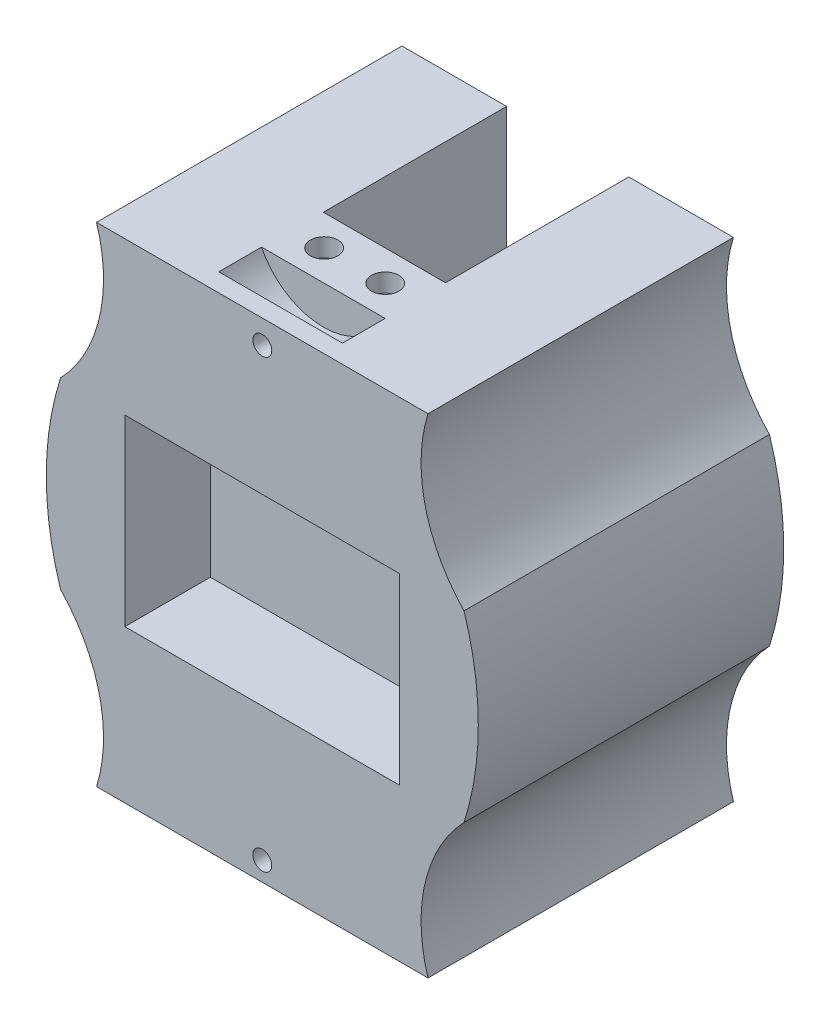
ISO-10303-21;
HEADER;
FILE_DESCRIPTION(('STEP AP214'),'2;1');
FILE_NAME('part.step','',(''),(''),'','','');
FILE_SCHEMA(('AUTOMOTIVE_DESIGN { 1 0 10303 214 1 1 1 1 }'));
ENDSEC;
DATA;
#1=APPLICATION_CONTEXT('core data for automotive mechanical design processes');
#2=APPLICATION_PROTOCOL_DEFINITION('international standard','automotive_design',2000,#1);
#3=PRODUCT_CONTEXT('',#1,'mechanical');
#4=PRODUCT('Part','Part','',(#3));
#5=PRODUCT_RELATED_PRODUCT_CATEGORY('part','',(#4));
#6=PRODUCT_DEFINITION_FORMATION('','',#4);
#7=PRODUCT_DEFINITION_CONTEXT('part definition',#1,'design');
#8=PRODUCT_DEFINITION('design','',#6,#7);
#9=PRODUCT_DEFINITION_SHAPE('','',#8);
#10=(LENGTH_UNIT() NAMED_UNIT(*) SI_UNIT(.MILLI.,.METRE.));
#11=(NAMED_UNIT(*) PLANE_ANGLE_UNIT() SI_UNIT($,.RADIAN.));
#12=(NAMED_UNIT(*) SI_UNIT($,.STERADIAN.) SOLID_ANGLE_UNIT());
#13=UNCERTAINTY_MEASURE_WITH_UNIT(LENGTH_MEASURE(1.E-05),#10,'distance_accuracy_value','');
#14=(GEOMETRIC_REPRESENTATION_CONTEXT(3) GLOBAL_UNCERTAINTY_ASSIGNED_CONTEXT((#13)) GLOBAL_UNIT_ASSIGNED_CONTEXT((#10,
#11,#12)) REPRESENTATION_CONTEXT('',''));
#15=CARTESIAN_POINT('',(0.,0.,0.));
#16=DIRECTION('',(0.,0.,1.));
#17=DIRECTION('',(1.,0.,0.));
#18=AXIS2_PLACEMENT_3D('',#15,#16,#17);
#19=CARTESIAN_POINT('',(0.,-40.,30.));
#20=DIRECTION('',(0.,1.,0.));
#21=DIRECTION('',(0.,0.,1.));
#22=AXIS2_PLACEMENT_3D('',#19,#20,#21);
#23=PLANE('',#22);
#24=CARTESIAN_POINT('',(5.12499999999996,-40.,15.));
#25=DIRECTION('',(0.,-1.,0.));
#26=DIRECTION('',(0.,0.,-1.));
#27=AXIS2_PLACEMENT_3D('',#24,#25,#26);
#28=CIRCLE('',#27,2.25);
#29=CARTESIAN_POINT('',(5.12499999999996,-40.,12.75));
#30=VERTEX_POINT('',#29);
#31=EDGE_CURVE('E452',#30,#30,#28,.T.);
#32=ORIENTED_EDGE('',*,*,#31,.F.);
#33=EDGE_LOOP('',(#32));
#34=FACE_BOUND('',#33,.T.);
#35=CARTESIAN_POINT('',(-4.87500000000004,-40.,15.));
#36=DIRECTION('',(0.,-1.,0.));
#37=DIRECTION('',(0.,0.,-1.));
#38=AXIS2_PLACEMENT_3D('',#35,#36,#37);
#39=CIRCLE('',#38,2.25);
#40=CARTESIAN_POINT('',(-4.87500000000004,-40.,12.75));
#41=VERTEX_POINT('',#40);
#42=EDGE_CURVE('E447',#41,#41,#39,.T.);
#43=ORIENTED_EDGE('',*,*,#42,.F.);
#44=EDGE_LOOP('',(#43));
#45=FACE_BOUND('',#44,.T.);
#46=DIRECTION('',(1.,0.,0.));
#47=VECTOR('',#46,1.);
#48=CARTESIAN_POINT('',(-10.1193783877815,-40.,27.));
#49=LINE('',#48,#47);
#50=CARTESIAN_POINT('',(-10.1193783877815,-40.,27.));
#51=VERTEX_POINT('',#50);
#52=CARTESIAN_POINT('',(10.1193783877815,-40.,27.));
#53=VERTEX_POINT('',#52);
#54=EDGE_CURVE('E557',#51,#53,#49,.T.);
#55=ORIENTED_EDGE('',*,*,#54,.T.);
#56=DIRECTION('',(0.,0.,1.));
#57=VECTOR('',#56,1.);
#58=CARTESIAN_POINT('',(10.1193783877815,-40.,20.));
#59=LINE('',#58,#57);
#60=CARTESIAN_POINT('',(10.1193783877815,-40.,20.));
#61=VERTEX_POINT('',#60);
#62=EDGE_CURVE('E620',#61,#53,#59,.T.);
#63=ORIENTED_EDGE('',*,*,#62,.F.);
#64=DIRECTION('',(1.,0.,0.));
#65=VECTOR('',#64,1.);
#66=CARTESIAN_POINT('',(0.,-40.,20.));
#67=LINE('',#66,#65);
#68=CARTESIAN_POINT('',(-10.1193783877815,-40.,20.));
#69=VERTEX_POINT('',#68);
#70=EDGE_CURVE('E616',#69,#61,#67,.T.);
#71=ORIENTED_EDGE('',*,*,#70,.F.);
#72=DIRECTION('',(0.,0.,1.));
#73=VECTOR('',#72,1.);
#74=CARTESIAN_POINT('',(-10.1193783877815,-40.,20.));
#75=LINE('',#74,#73);
#76=EDGE_CURVE('E619',#69,#51,#75,.T.);
#77=ORIENTED_EDGE('',*,*,#76,.T.);
#78=EDGE_LOOP('',(#55,#63,#71,#77));
#79=FACE_BOUND('',#78,.T.);
#80=DIRECTION('',(0.,0.,-1.));
#81=VECTOR('',#80,1.);
#82=CARTESIAN_POINT('',(9.99999999999994,-40.,10.));
#83=LINE('',#82,#81);
#84=CARTESIAN_POINT('',(9.99999999999994,-40.,10.));
#85=VERTEX_POINT('',#84);
#86=CARTESIAN_POINT('',(9.99999999999994,-40.,-20.));
#87=VERTEX_POINT('',#86);
#88=EDGE_CURVE('E472',#85,#87,#83,.T.);
#89=ORIENTED_EDGE('',*,*,#88,.T.);
#90=DIRECTION('',(-1.,0.,0.));
#91=VECTOR('',#90,1.);
#92=CARTESIAN_POINT('',(27.1336624385242,-40.,-20.));
#93=LINE('',#92,#91);
#94=CARTESIAN_POINT('',(27.1336624385242,-40.,-20.));
#95=VERTEX_POINT('',#94);
#96=EDGE_CURVE('E526',#95,#87,#93,.T.);
#97=ORIENTED_EDGE('',*,*,#96,.F.);
#98=DIRECTION('',(0.,0.,1.));
#99=VECTOR('',#98,1.);
#100=CARTESIAN_POINT('',(27.1336624385242,-40.,14.));
#101=LINE('',#100,#99);
#102=CARTESIAN_POINT('',(27.1336624385242,-40.,30.));
#103=VERTEX_POINT('',#102);
#104=EDGE_CURVE('E570',#95,#103,#101,.T.);
#105=ORIENTED_EDGE('',*,*,#104,.T.);
#106=DIRECTION('',(1.,0.,0.));
#107=VECTOR('',#106,1.);
#108=CARTESIAN_POINT('',(0.,-40.,30.));
#109=LINE('',#108,#107);
#110=CARTESIAN_POINT('',(-27.1336624385243,-40.,30.));
#111=VERTEX_POINT('',#110);
#112=EDGE_CURVE('E638',#111,#103,#109,.T.);
#113=ORIENTED_EDGE('',*,*,#112,.F.);
#114=DIRECTION('',(0.,0.,1.));
#115=VECTOR('',#114,1.);
#116=CARTESIAN_POINT('',(-27.1336624385243,-40.,14.));
#117=LINE('',#116,#115);
#118=CARTESIAN_POINT('',(-27.1336624385243,-40.,-20.));
#119=VERTEX_POINT('',#118);
#120=EDGE_CURVE('E580',#119,#111,#117,.T.);
#121=ORIENTED_EDGE('',*,*,#120,.F.);
#122=CARTESIAN_POINT('',(-10.,-40.,-20.));
#123=VERTEX_POINT('',#122);
#124=EDGE_CURVE('E525',#123,#119,#93,.T.);
#125=ORIENTED_EDGE('',*,*,#124,.F.);
#126=DIRECTION('',(0.,0.,-1.));
#127=VECTOR('',#126,1.);
#128=CARTESIAN_POINT('',(-10.,-40.,10.));
#129=LINE('',#128,#127);
#130=CARTESIAN_POINT('',(-10.,-40.,10.));
#131=VERTEX_POINT('',#130);
#132=EDGE_CURVE('E265',#131,#123,#129,.T.);
#133=ORIENTED_EDGE('',*,*,#132,.F.);
#134=DIRECTION('',(-1.,0.,0.));
#135=VECTOR('',#134,1.);
#136=CARTESIAN_POINT('',(0.,-40.,10.));
#137=LINE('',#136,#135);
#138=EDGE_CURVE('E463',#85,#131,#137,.T.);
#139=ORIENTED_EDGE('',*,*,#138,.F.);
#140=EDGE_LOOP('',(#89,#97,#105,#113,#121,#125,#133,#139));
#141=FACE_BOUND('',#140,.T.);
#142=ADVANCED_FACE('F250',(#34,#45,#79,#141),#23,.F.);
#143=CARTESIAN_POINT('',(51.2596627791283,32.4928057587116,-20.));
#144=DIRECTION('',(0.,0.,-1.));
#145=DIRECTION('',(-1.,0.,0.));
#146=AXIS2_PLACEMENT_3D('',#143,#144,#145);
#147=PLANE('',#146);
#148=CARTESIAN_POINT('',(28.2211690363349,-3.29857819905195,-20.));
#149=DIRECTION('',(0.,0.,-1.));
#150=DIRECTION('',(-1.,0.,0.));
#151=AXIS2_PLACEMENT_3D('',#148,#149,#150);
#152=CIRCLE('',#151,2.);
#153=CARTESIAN_POINT('',(26.2211690363349,-3.29857819905195,-20.));
#154=VERTEX_POINT('',#153);
#155=EDGE_CURVE('E441',#154,#154,#152,.T.);
#156=ORIENTED_EDGE('',*,*,#155,.F.);
#157=EDGE_LOOP('',(#156));
#158=FACE_BOUND('',#157,.T.);
#159=CARTESIAN_POINT('',(28.2211690363349,10.0179041600844,-20.));
#160=DIRECTION('',(0.,0.,-1.));
#161=DIRECTION('',(-1.,0.,0.));
#162=AXIS2_PLACEMENT_3D('',#159,#160,#161);
#163=CIRCLE('',#162,2.);
#164=CARTESIAN_POINT('',(26.2211690363349,10.0179041600844,-20.));
#165=VERTEX_POINT('',#164);
#166=EDGE_CURVE('E438',#165,#165,#163,.T.);
#167=ORIENTED_EDGE('',*,*,#166,.F.);
#168=EDGE_LOOP('',(#167));
#169=FACE_BOUND('',#168,.T.);
#170=ORIENTED_EDGE('',*,*,#96,.T.);
#171=DIRECTION('',(0.,1.,0.));
#172=VECTOR('',#171,1.);
#173=CARTESIAN_POINT('',(9.99999999999999,0.,-20.));
#174=LINE('',#173,#172);
#175=CARTESIAN_POINT('',(9.99999999999998,-13.5,-20.));
#176=VERTEX_POINT('',#175);
#177=EDGE_CURVE('E451',#87,#176,#174,.T.);
#178=ORIENTED_EDGE('',*,*,#177,.T.);
#179=DIRECTION('',(-1.,0.,0.));
#180=VECTOR('',#179,1.);
#181=CARTESIAN_POINT('',(0.,-13.5,-20.));
#182=LINE('',#181,#180);
#183=CARTESIAN_POINT('',(-10.,-13.5,-20.));
#184=VERTEX_POINT('',#183);
#185=EDGE_CURVE('E464',#176,#184,#182,.T.);
#186=ORIENTED_EDGE('',*,*,#185,.T.);
#187=DIRECTION('',(0.,1.,0.));
#188=VECTOR('',#187,1.);
#189=CARTESIAN_POINT('',(-10.,0.,-20.));
#190=LINE('',#189,#188);
#191=EDGE_CURVE('E475',#123,#184,#190,.T.);
#192=ORIENTED_EDGE('',*,*,#191,.F.);
#193=ORIENTED_EDGE('',*,*,#124,.T.);
#194=CARTESIAN_POINT('',(-51.2596627791282,-32.4928057587116,-20.));
#195=DIRECTION('',(0.,0.,1.));
#196=DIRECTION('',(-1.,0.,0.));
#197=AXIS2_PLACEMENT_3D('',#194,#195,#196);
#198=CIRCLE('',#197,25.2670112560084);
#199=CARTESIAN_POINT('',(-33.027175167745,-15.,-20.));
#200=VERTEX_POINT('',#199);
#201=EDGE_CURVE('E529',#119,#200,#198,.T.);
#202=ORIENTED_EDGE('',*,*,#201,.T.);
#203=CARTESIAN_POINT('',(14.0025176860576,0.,-20.));
#204=DIRECTION('',(0.,0.,-1.));
#205=DIRECTION('',(1.,0.,0.));
#206=AXIS2_PLACEMENT_3D('',#203,#204,#205);
#207=CIRCLE('',#206,49.3638735303766);
#208=CARTESIAN_POINT('',(-33.027175167745,15.,-20.));
#209=VERTEX_POINT('',#208);
#210=EDGE_CURVE('E532',#200,#209,#207,.T.);
#211=ORIENTED_EDGE('',*,*,#210,.T.);
#212=CARTESIAN_POINT('',(-51.259662779128,32.4928057587116,-20.));
#213=DIRECTION('',(0.,0.,1.));
#214=DIRECTION('',(-1.,0.,0.));
#215=AXIS2_PLACEMENT_3D('',#212,#213,#214);
#216=CIRCLE('',#215,25.2670112560083);
#217=CARTESIAN_POINT('',(-27.1336624385242,40.,-20.));
#218=VERTEX_POINT('',#217);
#219=EDGE_CURVE('E535',#209,#218,#216,.T.);
#220=ORIENTED_EDGE('',*,*,#219,.T.);
#221=DIRECTION('',(1.,0.,0.));
#222=VECTOR('',#221,1.);
#223=CARTESIAN_POINT('',(27.1336624385243,40.,-20.));
#224=LINE('',#223,#222);
#225=CARTESIAN_POINT('',(-10.,40.,-20.));
#226=VERTEX_POINT('',#225);
#227=EDGE_CURVE('E539',#218,#226,#224,.T.);
#228=ORIENTED_EDGE('',*,*,#227,.T.);
#229=DIRECTION('',(0.,1.,0.));
#230=VECTOR('',#229,1.);
#231=CARTESIAN_POINT('',(-10.,32.4928057587116,-20.));
#232=LINE('',#231,#230);
#233=CARTESIAN_POINT('',(-10.,13.5,-20.));
#234=VERTEX_POINT('',#233);
#235=EDGE_CURVE('E258',#234,#226,#232,.T.);
#236=ORIENTED_EDGE('',*,*,#235,.F.);
#237=DIRECTION('',(1.,0.,0.));
#238=VECTOR('',#237,1.);
#239=CARTESIAN_POINT('',(51.2596627791283,13.5,-20.));
#240=LINE('',#239,#238);
#241=CARTESIAN_POINT('',(9.99999999999999,13.5,-20.));
#242=VERTEX_POINT('',#241);
#243=EDGE_CURVE('E641',#234,#242,#240,.T.);
#244=ORIENTED_EDGE('',*,*,#243,.T.);
#245=DIRECTION('',(0.,-1.,0.));
#246=VECTOR('',#245,1.);
#247=CARTESIAN_POINT('',(9.99999999999999,32.4928057587116,-20.));
#248=LINE('',#247,#246);
#249=CARTESIAN_POINT('',(10.,40.,-20.));
#250=VERTEX_POINT('',#249);
#251=EDGE_CURVE('E12',#250,#242,#248,.T.);
#252=ORIENTED_EDGE('',*,*,#251,.F.);
#253=CARTESIAN_POINT('',(27.1336624385243,40.,-20.));
#254=VERTEX_POINT('',#253);
#255=EDGE_CURVE('E538',#250,#254,#224,.T.);
#256=ORIENTED_EDGE('',*,*,#255,.T.);
#257=CARTESIAN_POINT('',(51.2596627791283,32.4928057587116,-20.));
#258=DIRECTION('',(0.,0.,1.));
#259=DIRECTION('',(-1.,0.,0.));
#260=AXIS2_PLACEMENT_3D('',#257,#258,#259);
#261=CIRCLE('',#260,25.2670112560085);
#262=CARTESIAN_POINT('',(33.027175167745,15.,-20.));
#263=VERTEX_POINT('',#262);
#264=EDGE_CURVE('E514',#254,#263,#261,.T.);
#265=ORIENTED_EDGE('',*,*,#264,.T.);
#266=CARTESIAN_POINT('',(-14.0025176860581,0.,-20.));
#267=DIRECTION('',(0.,0.,-1.));
#268=DIRECTION('',(1.,0.,0.));
#269=AXIS2_PLACEMENT_3D('',#266,#267,#268);
#270=CIRCLE('',#269,49.363873530377);
#271=CARTESIAN_POINT('',(33.027175167745,-15.,-20.));
#272=VERTEX_POINT('',#271);
#273=EDGE_CURVE('E519',#263,#272,#270,.T.);
#274=ORIENTED_EDGE('',*,*,#273,.T.);
#275=CARTESIAN_POINT('',(51.2596627791291,-32.4928057587118,-20.));
#276=DIRECTION('',(0.,0.,1.));
#277=DIRECTION('',(-1.,0.,0.));
#278=AXIS2_PLACEMENT_3D('',#275,#276,#277);
#279=CIRCLE('',#278,25.2670112560092);
#280=EDGE_CURVE('E522',#272,#95,#279,.T.);
#281=ORIENTED_EDGE('',*,*,#280,.T.);
#282=EDGE_LOOP('',(#170,#178,#186,#192,#193,#202,#211,#220,#228,#236,#244,#252,#256,#265,#274,#281));
#283=FACE_BOUND('',#282,.T.);
#284=ADVANCED_FACE('F655',(#158,#169,#283),#147,.T.);
#285=CARTESIAN_POINT('',(0.,40.,30.));
#286=DIRECTION('',(0.,1.,0.));
#287=DIRECTION('',(0.,0.,1.));
#288=AXIS2_PLACEMENT_3D('',#285,#286,#287);
#289=PLANE('',#288);
#290=CARTESIAN_POINT('',(5.125,40.,15.));
#291=DIRECTION('',(0.,1.,0.));
#292=DIRECTION('',(0.,0.,1.));
#293=AXIS2_PLACEMENT_3D('',#290,#291,#292);
#294=CIRCLE('',#293,2.25);
#295=CARTESIAN_POINT('',(5.125,40.,17.25));
#296=VERTEX_POINT('',#295);
#297=EDGE_CURVE('E482',#296,#296,#294,.T.);
#298=ORIENTED_EDGE('',*,*,#297,.F.);
#299=EDGE_LOOP('',(#298));
#300=FACE_BOUND('',#299,.T.);
#301=CARTESIAN_POINT('',(-4.875,40.,15.));
#302=DIRECTION('',(0.,1.,0.));
#303=DIRECTION('',(0.,0.,1.));
#304=AXIS2_PLACEMENT_3D('',#301,#302,#303);
#305=CIRCLE('',#304,2.25);
#306=CARTESIAN_POINT('',(-4.875,40.,17.25));
#307=VERTEX_POINT('',#306);
#308=EDGE_CURVE('E491',#307,#307,#305,.T.);
#309=ORIENTED_EDGE('',*,*,#308,.F.);
#310=EDGE_LOOP('',(#309));
#311=FACE_BOUND('',#310,.T.);
#312=DIRECTION('',(0.,0.,-1.));
#313=VECTOR('',#312,1.);
#314=CARTESIAN_POINT('',(9.99999999999999,40.,-50.));
#315=LINE('',#314,#313);
#316=CARTESIAN_POINT('',(10.,40.,10.));
#317=VERTEX_POINT('',#316);
#318=EDGE_CURVE('E497',#317,#250,#315,.T.);
#319=ORIENTED_EDGE('',*,*,#318,.F.);
#320=DIRECTION('',(1.,0.,0.));
#321=VECTOR('',#320,1.);
#322=CARTESIAN_POINT('',(-10.,40.,10.));
#323=LINE('',#322,#321);
#324=CARTESIAN_POINT('',(-10.,40.,10.));
#325=VERTEX_POINT('',#324);
#326=EDGE_CURVE('E502',#325,#317,#323,.T.);
#327=ORIENTED_EDGE('',*,*,#326,.F.);
#328=DIRECTION('',(0.,0.,1.));
#329=VECTOR('',#328,1.);
#330=CARTESIAN_POINT('',(-10.,40.,-50.));
#331=LINE('',#330,#329);
#332=EDGE_CURVE('E508',#226,#325,#331,.T.);
#333=ORIENTED_EDGE('',*,*,#332,.F.);
#334=ORIENTED_EDGE('',*,*,#227,.F.);
#335=DIRECTION('',(0.,0.,1.));
#336=VECTOR('',#335,1.);
#337=CARTESIAN_POINT('',(-27.1336624385242,40.,14.));
#338=LINE('',#337,#336);
#339=CARTESIAN_POINT('',(-27.1336624385242,40.,30.));
#340=VERTEX_POINT('',#339);
#341=EDGE_CURVE('E583',#218,#340,#338,.T.);
#342=ORIENTED_EDGE('',*,*,#341,.T.);
#343=DIRECTION('',(1.,0.,0.));
#344=VECTOR('',#343,1.);
#345=CARTESIAN_POINT('',(0.,40.,30.));
#346=LINE('',#345,#344);
#347=CARTESIAN_POINT('',(27.1336624385243,40.,30.));
#348=VERTEX_POINT('',#347);
#349=EDGE_CURVE('E634',#340,#348,#346,.T.);
#350=ORIENTED_EDGE('',*,*,#349,.T.);
#351=DIRECTION('',(0.,0.,1.));
#352=VECTOR('',#351,1.);
#353=CARTESIAN_POINT('',(27.1336624385243,40.,14.));
#354=LINE('',#353,#352);
#355=EDGE_CURVE('E595',#254,#348,#354,.T.);
#356=ORIENTED_EDGE('',*,*,#355,.F.);
#357=ORIENTED_EDGE('',*,*,#255,.F.);
#358=EDGE_LOOP('',(#319,#327,#333,#334,#342,#350,#356,#357));
#359=FACE_BOUND('',#358,.T.);
#360=DIRECTION('',(-1.,0.,0.));
#361=VECTOR('',#360,1.);
#362=CARTESIAN_POINT('',(-10.1193783877815,40.,27.));
#363=LINE('',#362,#361);
#364=CARTESIAN_POINT('',(10.1193783877815,40.,27.));
#365=VERTEX_POINT('',#364);
#366=CARTESIAN_POINT('',(-10.1193783877815,40.,27.));
#367=VERTEX_POINT('',#366);
#368=EDGE_CURVE('E562',#365,#367,#363,.T.);
#369=ORIENTED_EDGE('',*,*,#368,.T.);
#370=DIRECTION('',(0.,0.,1.));
#371=VECTOR('',#370,1.);
#372=CARTESIAN_POINT('',(-10.1193783877815,40.,20.));
#373=LINE('',#372,#371);
#374=CARTESIAN_POINT('',(-10.1193783877815,40.,20.));
#375=VERTEX_POINT('',#374);
#376=EDGE_CURVE('E630',#375,#367,#373,.T.);
#377=ORIENTED_EDGE('',*,*,#376,.F.);
#378=DIRECTION('',(-1.,0.,0.));
#379=VECTOR('',#378,1.);
#380=CARTESIAN_POINT('',(0.,40.,20.));
#381=LINE('',#380,#379);
#382=CARTESIAN_POINT('',(10.1193783877815,40.,20.));
#383=VERTEX_POINT('',#382);
#384=EDGE_CURVE('E623',#383,#375,#381,.T.);
#385=ORIENTED_EDGE('',*,*,#384,.F.);
#386=DIRECTION('',(0.,0.,1.));
#387=VECTOR('',#386,1.);
#388=CARTESIAN_POINT('',(10.1193783877815,40.,20.));
#389=LINE('',#388,#387);
#390=EDGE_CURVE('E631',#383,#365,#389,.T.);
#391=ORIENTED_EDGE('',*,*,#390,.T.);
#392=EDGE_LOOP('',(#369,#377,#385,#391));
#393=FACE_BOUND('',#392,.T.);
#394=ADVANCED_FACE('F252',(#300,#311,#359,#393),#289,.T.);
#395=CARTESIAN_POINT('',(0.,44.9918574381775,20.));
#396=DIRECTION('',(0.,0.,1.));
#397=DIRECTION('',(1.,0.,0.));
#398=AXIS2_PLACEMENT_3D('',#395,#396,#397);
#399=CYLINDRICAL_SURFACE('',#398,11.283636809034);
#400=CARTESIAN_POINT('',(0.,44.9918574381775,27.));
#401=DIRECTION('',(0.,0.,1.));
#402=DIRECTION('',(1.,0.,0.));
#403=AXIS2_PLACEMENT_3D('',#400,#401,#402);
#404=CIRCLE('',#403,11.283636809034);
#405=EDGE_CURVE('E560',#367,#365,#404,.T.);
#406=ORIENTED_EDGE('',*,*,#405,.T.);
#407=ORIENTED_EDGE('',*,*,#390,.F.);
#408=CARTESIAN_POINT('',(0.,44.9918574381775,20.));
#409=DIRECTION('',(0.,0.,1.));
#410=DIRECTION('',(1.,0.,0.));
#411=AXIS2_PLACEMENT_3D('',#408,#409,#410);
#412=CIRCLE('',#411,11.283636809034);
#413=EDGE_CURVE('E627',#375,#383,#412,.T.);
#414=ORIENTED_EDGE('',*,*,#413,.F.);
#415=ORIENTED_EDGE('',*,*,#376,.T.);
#416=EDGE_LOOP('',(#406,#407,#414,#415));
#417=FACE_BOUND('',#416,.T.);
#418=ADVANCED_FACE('F707',(#417),#399,.F.);
#419=CARTESIAN_POINT('',(0.,0.,30.));
#420=DIRECTION('',(0.,0.,1.));
#421=DIRECTION('',(1.,0.,0.));
#422=AXIS2_PLACEMENT_3D('',#419,#420,#421);
#423=PLANE('',#422);
#424=CARTESIAN_POINT('',(0.,36.1458896854283,30.));
#425=DIRECTION('',(0.,0.,1.));
#426=DIRECTION('',(1.,0.,0.));
#427=AXIS2_PLACEMENT_3D('',#424,#425,#426);
#428=CIRCLE('',#427,1.55);
#429=CARTESIAN_POINT('',(1.55,36.1458896854283,30.));
#430=VERTEX_POINT('',#429);
#431=EDGE_CURVE('E545',#430,#430,#428,.T.);
#432=ORIENTED_EDGE('',*,*,#431,.F.);
#433=EDGE_LOOP('',(#432));
#434=FACE_BOUND('',#433,.T.);
#435=CARTESIAN_POINT('',(0.,-36.8541103145717,30.));
#436=DIRECTION('',(0.,0.,-1.));
#437=DIRECTION('',(-1.,0.,0.));
#438=AXIS2_PLACEMENT_3D('',#435,#436,#437);
#439=CIRCLE('',#438,1.55);
#440=CARTESIAN_POINT('',(-1.55000000000001,-36.8541103145717,30.));
#441=VERTEX_POINT('',#440);
#442=EDGE_CURVE('E549',#441,#441,#439,.T.);
#443=ORIENTED_EDGE('',*,*,#442,.T.);
#444=EDGE_LOOP('',(#443));
#445=FACE_BOUND('',#444,.T.);
#446=CARTESIAN_POINT('',(-51.2596627791281,-32.4928057587115,30.));
#447=DIRECTION('',(0.,0.,1.));
#448=DIRECTION('',(1.,0.,0.));
#449=AXIS2_PLACEMENT_3D('',#446,#447,#448);
#450=CIRCLE('',#449,25.2670112560083);
#451=CARTESIAN_POINT('',(-33.027175167745,-15.,30.));
#452=VERTEX_POINT('',#451);
#453=EDGE_CURVE('E573',#111,#452,#450,.T.);
#454=ORIENTED_EDGE('',*,*,#453,.F.);
#455=ORIENTED_EDGE('',*,*,#112,.T.);
#456=CARTESIAN_POINT('',(51.259662779128,-32.4928057587116,30.));
#457=DIRECTION('',(0.,0.,1.));
#458=DIRECTION('',(1.,0.,0.));
#459=AXIS2_PLACEMENT_3D('',#456,#457,#458);
#460=CIRCLE('',#459,25.2670112560083);
#461=CARTESIAN_POINT('',(33.027175167745,-15.,30.));
#462=VERTEX_POINT('',#461);
#463=EDGE_CURVE('E592',#103,#462,#460,.F.);
#464=ORIENTED_EDGE('',*,*,#463,.T.);
#465=CARTESIAN_POINT('',(-14.0025176860571,0.,30.));
#466=DIRECTION('',(0.,0.,1.));
#467=DIRECTION('',(1.,0.,0.));
#468=AXIS2_PLACEMENT_3D('',#465,#466,#467);
#469=CIRCLE('',#468,49.3638735303761);
#470=CARTESIAN_POINT('',(33.027175167745,15.,30.));
#471=VERTEX_POINT('',#470);
#472=EDGE_CURVE('E589',#471,#462,#469,.F.);
#473=ORIENTED_EDGE('',*,*,#472,.F.);
#474=CARTESIAN_POINT('',(51.259662779128,32.4928057587115,30.));
#475=DIRECTION('',(0.,0.,1.));
#476=DIRECTION('',(1.,0.,0.));
#477=AXIS2_PLACEMENT_3D('',#474,#475,#476);
#478=CIRCLE('',#477,25.2670112560083);
#479=EDGE_CURVE('E565',#348,#471,#478,.T.);
#480=ORIENTED_EDGE('',*,*,#479,.F.);
#481=ORIENTED_EDGE('',*,*,#349,.F.);
#482=CARTESIAN_POINT('',(-51.259662779128,32.4928057587116,30.));
#483=DIRECTION('',(0.,0.,1.));
#484=DIRECTION('',(1.,0.,0.));
#485=AXIS2_PLACEMENT_3D('',#482,#483,#484);
#486=CIRCLE('',#485,25.2670112560083);
#487=CARTESIAN_POINT('',(-33.027175167745,15.,30.));
#488=VERTEX_POINT('',#487);
#489=EDGE_CURVE('E569',#340,#488,#486,.F.);
#490=ORIENTED_EDGE('',*,*,#489,.T.);
#491=CARTESIAN_POINT('',(14.0025176860571,0.,30.));
#492=DIRECTION('',(0.,0.,1.));
#493=DIRECTION('',(1.,0.,0.));
#494=AXIS2_PLACEMENT_3D('',#491,#492,#493);
#495=CIRCLE('',#494,49.3638735303761);
#496=EDGE_CURVE('E566',#488,#452,#495,.T.);
#497=ORIENTED_EDGE('',*,*,#496,.T.);
#498=EDGE_LOOP('',(#454,#455,#464,#473,#480,#481,#490,#497));
#499=FACE_BOUND('',#498,.T.);
#500=DIRECTION('',(1.,0.,0.));
#501=VECTOR('',#500,1.);
#502=CARTESIAN_POINT('',(-22.5,-15.,30.));
#503=LINE('',#502,#501);
#504=CARTESIAN_POINT('',(-22.5,-15.,30.));
#505=VERTEX_POINT('',#504);
#506=CARTESIAN_POINT('',(22.5,-15.,30.));
#507=VERTEX_POINT('',#506);
#508=EDGE_CURVE('E579',#505,#507,#503,.T.);
#509=ORIENTED_EDGE('',*,*,#508,.F.);
#510=DIRECTION('',(0.,-1.,0.));
#511=VECTOR('',#510,1.);
#512=CARTESIAN_POINT('',(-22.5,15.,30.));
#513=LINE('',#512,#511);
#514=CARTESIAN_POINT('',(-22.5,15.,30.));
#515=VERTEX_POINT('',#514);
#516=EDGE_CURVE('E419',#515,#505,#513,.T.);
#517=ORIENTED_EDGE('',*,*,#516,.F.);
#518=DIRECTION('',(1.,0.,0.));
#519=VECTOR('',#518,1.);
#520=CARTESIAN_POINT('',(-22.5,15.,30.));
#521=LINE('',#520,#519);
#522=CARTESIAN_POINT('',(22.5,15.,30.));
#523=VERTEX_POINT('',#522);
#524=EDGE_CURVE('E607',#515,#523,#521,.T.);
#525=ORIENTED_EDGE('',*,*,#524,.T.);
#526=DIRECTION('',(0.,-1.,0.));
#527=VECTOR('',#526,1.);
#528=CARTESIAN_POINT('',(22.5,15.,30.));
#529=LINE('',#528,#527);
#530=EDGE_CURVE('E604',#523,#507,#529,.T.);
#531=ORIENTED_EDGE('',*,*,#530,.T.);
#532=EDGE_LOOP('',(#509,#517,#525,#531));
#533=FACE_BOUND('',#532,.T.);
#534=ADVANCED_FACE('F668',(#434,#445,#499,#533),#423,.T.);
#535=CARTESIAN_POINT('',(0.,0.,20.));
#536=DIRECTION('',(0.,0.,1.));
#537=DIRECTION('',(1.,0.,0.));
#538=AXIS2_PLACEMENT_3D('',#535,#536,#537);
#539=PLANE('',#538);
#540=ORIENTED_EDGE('',*,*,#384,.T.);
#541=ORIENTED_EDGE('',*,*,#413,.T.);
#542=EDGE_LOOP('',(#540,#541));
#543=FACE_BOUND('',#542,.T.);
#544=ADVANCED_FACE('F706',(#543),#539,.T.);
#545=CARTESIAN_POINT('',(0.,-44.9918574381775,20.));
#546=DIRECTION('',(0.,0.,1.));
#547=DIRECTION('',(1.,0.,0.));
#548=AXIS2_PLACEMENT_3D('',#545,#546,#547);
#549=CYLINDRICAL_SURFACE('',#548,11.283636809034);
#550=CARTESIAN_POINT('',(0.,-44.9918574381775,27.));
#551=DIRECTION('',(0.,0.,1.));
#552=DIRECTION('',(-1.,0.,0.));
#553=AXIS2_PLACEMENT_3D('',#550,#551,#552);
#554=CIRCLE('',#553,11.283636809034);
#555=EDGE_CURVE('E552',#53,#51,#554,.T.);
#556=ORIENTED_EDGE('',*,*,#555,.T.);
#557=ORIENTED_EDGE('',*,*,#76,.F.);
#558=CARTESIAN_POINT('',(0.,-44.9918574381775,20.));
#559=DIRECTION('',(0.,0.,1.));
#560=DIRECTION('',(1.,0.,0.));
#561=AXIS2_PLACEMENT_3D('',#558,#559,#560);
#562=CIRCLE('',#561,11.283636809034);
#563=EDGE_CURVE('E422',#69,#61,#562,.F.);
#564=ORIENTED_EDGE('',*,*,#563,.T.);
#565=ORIENTED_EDGE('',*,*,#62,.T.);
#566=EDGE_LOOP('',(#556,#557,#564,#565));
#567=FACE_BOUND('',#566,.T.);
#568=ADVANCED_FACE('F714',(#567),#549,.F.);
#569=CARTESIAN_POINT('',(0.,0.,20.));
#570=DIRECTION('',(0.,0.,1.));
#571=DIRECTION('',(1.,0.,0.));
#572=AXIS2_PLACEMENT_3D('',#569,#570,#571);
#573=PLANE('',#572);
#574=ORIENTED_EDGE('',*,*,#563,.F.);
#575=ORIENTED_EDGE('',*,*,#70,.T.);
#576=EDGE_LOOP('',(#574,#575));
#577=FACE_BOUND('',#576,.T.);
#578=ADVANCED_FACE('F718',(#577),#573,.T.);
#579=CARTESIAN_POINT('',(-22.5,-15.,24.));
#580=DIRECTION('',(0.,-1.,0.));
#581=DIRECTION('',(0.,0.,-1.));
#582=AXIS2_PLACEMENT_3D('',#579,#580,#581);
#583=PLANE('',#582);
#584=ORIENTED_EDGE('',*,*,#508,.T.);
#585=DIRECTION('',(0.,0.,1.));
#586=VECTOR('',#585,1.);
#587=CARTESIAN_POINT('',(22.5,-15.,24.));
#588=LINE('',#587,#586);
#589=CARTESIAN_POINT('',(22.5,-15.,16.));
#590=VERTEX_POINT('',#589);
#591=EDGE_CURVE('E429',#590,#507,#588,.T.);
#592=ORIENTED_EDGE('',*,*,#591,.F.);
#593=DIRECTION('',(1.,0.,0.));
#594=VECTOR('',#593,1.);
#595=CARTESIAN_POINT('',(-22.5,-15.,16.));
#596=LINE('',#595,#594);
#597=CARTESIAN_POINT('',(-22.5,-15.,16.));
#598=VERTEX_POINT('',#597);
#599=EDGE_CURVE('E426',#598,#590,#596,.T.);
#600=ORIENTED_EDGE('',*,*,#599,.F.);
#601=DIRECTION('',(0.,0.,1.));
#602=VECTOR('',#601,1.);
#603=CARTESIAN_POINT('',(-22.5,-15.,24.));
#604=LINE('',#603,#602);
#605=EDGE_CURVE('E412',#598,#505,#604,.T.);
#606=ORIENTED_EDGE('',*,*,#605,.T.);
#607=EDGE_LOOP('',(#584,#592,#600,#606));
#608=FACE_BOUND('',#607,.T.);
#609=ADVANCED_FACE('F427',(#608),#583,.F.);
#610=CARTESIAN_POINT('',(-22.5,15.,24.));
#611=DIRECTION('',(-1.,0.,0.));
#612=DIRECTION('',(0.,-1.,0.));
#613=AXIS2_PLACEMENT_3D('',#610,#611,#612);
#614=PLANE('',#613);
#615=ORIENTED_EDGE('',*,*,#516,.T.);
#616=ORIENTED_EDGE('',*,*,#605,.F.);
#617=DIRECTION('',(0.,-1.,0.));
#618=VECTOR('',#617,1.);
#619=CARTESIAN_POINT('',(-22.5,15.,16.));
#620=LINE('',#619,#618);
#621=CARTESIAN_POINT('',(-22.5,15.,16.));
#622=VERTEX_POINT('',#621);
#623=EDGE_CURVE('E416',#622,#598,#620,.T.);
#624=ORIENTED_EDGE('',*,*,#623,.F.);
#625=DIRECTION('',(0.,0.,1.));
#626=VECTOR('',#625,1.);
#627=CARTESIAN_POINT('',(-22.5,15.,24.));
#628=LINE('',#627,#626);
#629=EDGE_CURVE('E423',#622,#515,#628,.T.);
#630=ORIENTED_EDGE('',*,*,#629,.T.);
#631=EDGE_LOOP('',(#615,#616,#624,#630));
#632=FACE_BOUND('',#631,.T.);
#633=ADVANCED_FACE('F414',(#632),#614,.F.);
#634=CARTESIAN_POINT('',(-22.5,15.,24.));
#635=DIRECTION('',(0.,-1.,0.));
#636=DIRECTION('',(0.,0.,-1.));
#637=AXIS2_PLACEMENT_3D('',#634,#635,#636);
#638=PLANE('',#637);
#639=ORIENTED_EDGE('',*,*,#524,.F.);
#640=ORIENTED_EDGE('',*,*,#629,.F.);
#641=DIRECTION('',(-1.,0.,0.));
#642=VECTOR('',#641,1.);
#643=CARTESIAN_POINT('',(-22.5,15.,16.));
#644=LINE('',#643,#642);
#645=CARTESIAN_POINT('',(22.5,15.,16.));
#646=VERTEX_POINT('',#645);
#647=EDGE_CURVE('E437',#646,#622,#644,.T.);
#648=ORIENTED_EDGE('',*,*,#647,.F.);
#649=DIRECTION('',(0.,0.,1.));
#650=VECTOR('',#649,1.);
#651=CARTESIAN_POINT('',(22.5,15.,24.));
#652=LINE('',#651,#650);
#653=EDGE_CURVE('E612',#646,#523,#652,.T.);
#654=ORIENTED_EDGE('',*,*,#653,.T.);
#655=EDGE_LOOP('',(#639,#640,#648,#654));
#656=FACE_BOUND('',#655,.T.);
#657=ADVANCED_FACE('F729',(#656),#638,.T.);
#658=CARTESIAN_POINT('',(22.5,15.,24.));
#659=DIRECTION('',(-1.,0.,0.));
#660=DIRECTION('',(0.,-1.,0.));
#661=AXIS2_PLACEMENT_3D('',#658,#659,#660);
#662=PLANE('',#661);
#663=ORIENTED_EDGE('',*,*,#530,.F.);
#664=ORIENTED_EDGE('',*,*,#653,.F.);
#665=DIRECTION('',(0.,1.,0.));
#666=VECTOR('',#665,1.);
#667=CARTESIAN_POINT('',(22.5,15.,16.));
#668=LINE('',#667,#666);
#669=EDGE_CURVE('E433',#590,#646,#668,.T.);
#670=ORIENTED_EDGE('',*,*,#669,.F.);
#671=ORIENTED_EDGE('',*,*,#591,.T.);
#672=EDGE_LOOP('',(#663,#664,#670,#671));
#673=FACE_BOUND('',#672,.T.);
#674=ADVANCED_FACE('F725',(#673),#662,.T.);
#675=CARTESIAN_POINT('',(14.0025176860571,0.,14.));
#676=DIRECTION('',(0.,0.,1.));
#677=DIRECTION('',(1.,0.,0.));
#678=AXIS2_PLACEMENT_3D('',#675,#676,#677);
#679=CYLINDRICAL_SURFACE('',#678,49.3638735303761);
#680=ORIENTED_EDGE('',*,*,#496,.F.);
#681=DIRECTION('',(0.,0.,1.));
#682=VECTOR('',#681,1.);
#683=CARTESIAN_POINT('',(-33.027175167745,15.,14.));
#684=LINE('',#683,#682);
#685=EDGE_CURVE('E576',#209,#488,#684,.T.);
#686=ORIENTED_EDGE('',*,*,#685,.F.);
#687=ORIENTED_EDGE('',*,*,#210,.F.);
#688=DIRECTION('',(0.,0.,1.));
#689=VECTOR('',#688,1.);
#690=CARTESIAN_POINT('',(-33.027175167745,-15.,14.));
#691=LINE('',#690,#689);
#692=EDGE_CURVE('E577',#200,#452,#691,.T.);
#693=ORIENTED_EDGE('',*,*,#692,.T.);
#694=EDGE_LOOP('',(#680,#686,#687,#693));
#695=FACE_BOUND('',#694,.T.);
#696=ADVANCED_FACE('F728',(#695),#679,.T.);
#697=CARTESIAN_POINT('',(-51.2596627791281,-32.4928057587115,14.));
#698=DIRECTION('',(0.,0.,1.));
#699=DIRECTION('',(1.,0.,0.));
#700=AXIS2_PLACEMENT_3D('',#697,#698,#699);
#701=CYLINDRICAL_SURFACE('',#700,25.2670112560083);
#702=ORIENTED_EDGE('',*,*,#453,.T.);
#703=ORIENTED_EDGE('',*,*,#692,.F.);
#704=ORIENTED_EDGE('',*,*,#201,.F.);
#705=ORIENTED_EDGE('',*,*,#120,.T.);
#706=EDGE_LOOP('',(#702,#703,#704,#705));
#707=FACE_BOUND('',#706,.T.);
#708=ADVANCED_FACE('F749',(#707),#701,.F.);
#709=CARTESIAN_POINT('',(-51.259662779128,32.4928057587116,14.));
#710=DIRECTION('',(0.,0.,1.));
#711=DIRECTION('',(1.,0.,0.));
#712=AXIS2_PLACEMENT_3D('',#709,#710,#711);
#713=CYLINDRICAL_SURFACE('',#712,25.2670112560083);
#714=ORIENTED_EDGE('',*,*,#489,.F.);
#715=ORIENTED_EDGE('',*,*,#341,.F.);
#716=ORIENTED_EDGE('',*,*,#219,.F.);
#717=ORIENTED_EDGE('',*,*,#685,.T.);
#718=EDGE_LOOP('',(#714,#715,#716,#717));
#719=FACE_BOUND('',#718,.T.);
#720=ADVANCED_FACE('F660',(#719),#713,.F.);
#721=CARTESIAN_POINT('',(51.259662779128,-32.4928057587116,14.));
#722=DIRECTION('',(0.,0.,1.));
#723=DIRECTION('',(1.,0.,0.));
#724=AXIS2_PLACEMENT_3D('',#721,#722,#723);
#725=CYLINDRICAL_SURFACE('',#724,25.2670112560083);
#726=ORIENTED_EDGE('',*,*,#463,.F.);
#727=ORIENTED_EDGE('',*,*,#104,.F.);
#728=ORIENTED_EDGE('',*,*,#280,.F.);
#729=DIRECTION('',(0.,0.,1.));
#730=VECTOR('',#729,1.);
#731=CARTESIAN_POINT('',(33.027175167745,-15.,14.));
#732=LINE('',#731,#730);
#733=EDGE_CURVE('E598',#272,#462,#732,.T.);
#734=ORIENTED_EDGE('',*,*,#733,.T.);
#735=EDGE_LOOP('',(#726,#727,#728,#734));
#736=FACE_BOUND('',#735,.T.);
#737=ADVANCED_FACE('F742',(#736),#725,.F.);
#738=CARTESIAN_POINT('',(-14.0025176860571,0.,14.));
#739=DIRECTION('',(0.,0.,1.));
#740=DIRECTION('',(1.,0.,0.));
#741=AXIS2_PLACEMENT_3D('',#738,#739,#740);
#742=CYLINDRICAL_SURFACE('',#741,49.3638735303761);
#743=ORIENTED_EDGE('',*,*,#472,.T.);
#744=ORIENTED_EDGE('',*,*,#733,.F.);
#745=ORIENTED_EDGE('',*,*,#273,.F.);
#746=DIRECTION('',(0.,0.,1.));
#747=VECTOR('',#746,1.);
#748=CARTESIAN_POINT('',(33.027175167745,15.,14.));
#749=LINE('',#748,#747);
#750=EDGE_CURVE('E600',#263,#471,#749,.T.);
#751=ORIENTED_EDGE('',*,*,#750,.T.);
#752=EDGE_LOOP('',(#743,#744,#745,#751));
#753=FACE_BOUND('',#752,.T.);
#754=ADVANCED_FACE('F739',(#753),#742,.T.);
#755=CARTESIAN_POINT('',(51.259662779128,32.4928057587115,14.));
#756=DIRECTION('',(0.,0.,1.));
#757=DIRECTION('',(1.,0.,0.));
#758=AXIS2_PLACEMENT_3D('',#755,#756,#757);
#759=CYLINDRICAL_SURFACE('',#758,25.2670112560083);
#760=ORIENTED_EDGE('',*,*,#479,.T.);
#761=ORIENTED_EDGE('',*,*,#750,.F.);
#762=ORIENTED_EDGE('',*,*,#264,.F.);
#763=ORIENTED_EDGE('',*,*,#355,.T.);
#764=EDGE_LOOP('',(#760,#761,#762,#763));
#765=FACE_BOUND('',#764,.T.);
#766=ADVANCED_FACE('F672',(#765),#759,.F.);
#767=CARTESIAN_POINT('',(0.,44.9918574381775,27.));
#768=DIRECTION('',(0.,0.,1.));
#769=DIRECTION('',(1.,0.,0.));
#770=AXIS2_PLACEMENT_3D('',#767,#768,#769);
#771=PLANE('',#770);
#772=CARTESIAN_POINT('',(0.,36.1458896854283,27.));
#773=DIRECTION('',(0.,0.,-1.));
#774=DIRECTION('',(-1.,0.,0.));
#775=AXIS2_PLACEMENT_3D('',#772,#773,#774);
#776=CIRCLE('',#775,1.55);
#777=CARTESIAN_POINT('',(-1.55,36.1458896854283,27.));
#778=VERTEX_POINT('',#777);
#779=EDGE_CURVE('E542',#778,#778,#776,.T.);
#780=ORIENTED_EDGE('',*,*,#779,.F.);
#781=EDGE_LOOP('',(#780));
#782=FACE_BOUND('',#781,.T.);
#783=ORIENTED_EDGE('',*,*,#405,.F.);
#784=ORIENTED_EDGE('',*,*,#368,.F.);
#785=EDGE_LOOP('',(#783,#784));
#786=FACE_BOUND('',#785,.T.);
#787=ADVANCED_FACE('F738',(#782,#786),#771,.F.);
#788=CARTESIAN_POINT('',(0.,-44.9918574381775,27.));
#789=DIRECTION('',(0.,0.,-1.));
#790=DIRECTION('',(-1.,0.,0.));
#791=AXIS2_PLACEMENT_3D('',#788,#789,#790);
#792=PLANE('',#791);
#793=CARTESIAN_POINT('',(0.,-36.8541103145717,27.));
#794=DIRECTION('',(0.,0.,-1.));
#795=DIRECTION('',(-1.,0.,0.));
#796=AXIS2_PLACEMENT_3D('',#793,#794,#795);
#797=CIRCLE('',#796,1.55);
#798=CARTESIAN_POINT('',(-1.55000000000001,-36.8541103145717,27.));
#799=VERTEX_POINT('',#798);
#800=EDGE_CURVE('E548',#799,#799,#797,.T.);
#801=ORIENTED_EDGE('',*,*,#800,.F.);
#802=EDGE_LOOP('',(#801));
#803=FACE_BOUND('',#802,.T.);
#804=ORIENTED_EDGE('',*,*,#555,.F.);
#805=ORIENTED_EDGE('',*,*,#54,.F.);
#806=EDGE_LOOP('',(#804,#805));
#807=FACE_BOUND('',#806,.T.);
#808=ADVANCED_FACE('F758',(#803,#807),#792,.T.);
#809=CARTESIAN_POINT('',(0.,-36.8541103145717,30.));
#810=DIRECTION('',(0.,0.,-1.));
#811=DIRECTION('',(-1.,0.,0.));
#812=AXIS2_PLACEMENT_3D('',#809,#810,#811);
#813=CYLINDRICAL_SURFACE('',#812,1.55);
#814=ORIENTED_EDGE('',*,*,#442,.F.);
#815=EDGE_LOOP('',(#814));
#816=FACE_BOUND('',#815,.T.);
#817=ORIENTED_EDGE('',*,*,#800,.T.);
#818=EDGE_LOOP('',(#817));
#819=FACE_BOUND('',#818,.T.);
#820=ADVANCED_FACE('F762',(#816,#819),#813,.F.);
#821=CARTESIAN_POINT('',(0.,36.1458896854283,33.1007993212381));
#822=DIRECTION('',(0.,0.,-1.));
#823=DIRECTION('',(-1.,0.,0.));
#824=AXIS2_PLACEMENT_3D('',#821,#822,#823);
#825=CYLINDRICAL_SURFACE('',#824,1.55);
#826=ORIENTED_EDGE('',*,*,#431,.T.);
#827=EDGE_LOOP('',(#826));
#828=FACE_BOUND('',#827,.T.);
#829=ORIENTED_EDGE('',*,*,#779,.T.);
#830=EDGE_LOOP('',(#829));
#831=FACE_BOUND('',#830,.T.);
#832=ADVANCED_FACE('F766',(#828,#831),#825,.F.);
#833=CARTESIAN_POINT('',(9.99999999999999,13.5,-50.));
#834=DIRECTION('',(1.,0.,0.));
#835=DIRECTION('',(0.,0.,-1.));
#836=AXIS2_PLACEMENT_3D('',#833,#834,#835);
#837=PLANE('',#836);
#838=ORIENTED_EDGE('',*,*,#251,.T.);
#839=DIRECTION('',(0.,0.,-1.));
#840=VECTOR('',#839,1.);
#841=CARTESIAN_POINT('',(9.99999999999999,13.5,-50.));
#842=LINE('',#841,#840);
#843=CARTESIAN_POINT('',(10.,13.5,10.));
#844=VERTEX_POINT('',#843);
#845=EDGE_CURVE('E273',#844,#242,#842,.T.);
#846=ORIENTED_EDGE('',*,*,#845,.F.);
#847=DIRECTION('',(0.,1.,0.));
#848=VECTOR('',#847,1.);
#849=CARTESIAN_POINT('',(10.,13.5,10.));
#850=LINE('',#849,#848);
#851=EDGE_CURVE('E512',#844,#317,#850,.T.);
#852=ORIENTED_EDGE('',*,*,#851,.T.);
#853=ORIENTED_EDGE('',*,*,#318,.T.);
#854=EDGE_LOOP('',(#838,#846,#852,#853));
#855=FACE_BOUND('',#854,.T.);
#856=ADVANCED_FACE('F677',(#855),#837,.F.);
#857=CARTESIAN_POINT('',(-10.,13.5,10.));
#858=DIRECTION('',(0.,0.,1.));
#859=DIRECTION('',(1.,0.,0.));
#860=AXIS2_PLACEMENT_3D('',#857,#858,#859);
#861=PLANE('',#860);
#862=ORIENTED_EDGE('',*,*,#326,.T.);
#863=ORIENTED_EDGE('',*,*,#851,.F.);
#864=DIRECTION('',(1.,0.,0.));
#865=VECTOR('',#864,1.);
#866=CARTESIAN_POINT('',(-10.,13.5,10.));
#867=LINE('',#866,#865);
#868=CARTESIAN_POINT('',(-10.,13.5,10.));
#869=VERTEX_POINT('',#868);
#870=EDGE_CURVE('E504',#869,#844,#867,.T.);
#871=ORIENTED_EDGE('',*,*,#870,.F.);
#872=DIRECTION('',(0.,1.,0.));
#873=VECTOR('',#872,1.);
#874=CARTESIAN_POINT('',(-10.,13.5,10.));
#875=LINE('',#874,#873);
#876=EDGE_CURVE('E506',#869,#325,#875,.T.);
#877=ORIENTED_EDGE('',*,*,#876,.T.);
#878=EDGE_LOOP('',(#862,#863,#871,#877));
#879=FACE_BOUND('',#878,.T.);
#880=ADVANCED_FACE('F680',(#879),#861,.F.);
#881=CARTESIAN_POINT('',(-10.,13.5,-50.));
#882=DIRECTION('',(-1.,0.,0.));
#883=DIRECTION('',(0.,0.,1.));
#884=AXIS2_PLACEMENT_3D('',#881,#882,#883);
#885=PLANE('',#884);
#886=ORIENTED_EDGE('',*,*,#235,.T.);
#887=ORIENTED_EDGE('',*,*,#332,.T.);
#888=ORIENTED_EDGE('',*,*,#876,.F.);
#889=DIRECTION('',(0.,0.,1.));
#890=VECTOR('',#889,1.);
#891=CARTESIAN_POINT('',(-10.,13.5,-50.));
#892=LINE('',#891,#890);
#893=EDGE_CURVE('E501',#234,#869,#892,.T.);
#894=ORIENTED_EDGE('',*,*,#893,.F.);
#895=EDGE_LOOP('',(#886,#887,#888,#894));
#896=FACE_BOUND('',#895,.T.);
#897=ADVANCED_FACE('F647',(#896),#885,.F.);
#898=CARTESIAN_POINT('',(0.,13.5,0.));
#899=DIRECTION('',(0.,1.,0.));
#900=DIRECTION('',(0.,0.,1.));
#901=AXIS2_PLACEMENT_3D('',#898,#899,#900);
#902=PLANE('',#901);
#903=ORIENTED_EDGE('',*,*,#893,.T.);
#904=ORIENTED_EDGE('',*,*,#870,.T.);
#905=ORIENTED_EDGE('',*,*,#845,.T.);
#906=ORIENTED_EDGE('',*,*,#243,.F.);
#907=EDGE_LOOP('',(#903,#904,#905,#906));
#908=FACE_BOUND('',#907,.T.);
#909=ADVANCED_FACE('F681',(#908),#902,.T.);
#910=CARTESIAN_POINT('',(-4.875,37.,15.));
#911=DIRECTION('',(0.,1.,0.));
#912=DIRECTION('',(0.,0.,1.));
#913=AXIS2_PLACEMENT_3D('',#910,#911,#912);
#914=CYLINDRICAL_SURFACE('',#913,2.25);
#915=CARTESIAN_POINT('',(-4.875,37.,15.));
#916=DIRECTION('',(0.,1.,0.));
#917=DIRECTION('',(0.,0.,1.));
#918=AXIS2_PLACEMENT_3D('',#915,#916,#917);
#919=CIRCLE('',#918,2.25);
#920=CARTESIAN_POINT('',(-4.875,37.,17.25));
#921=VERTEX_POINT('',#920);
#922=EDGE_CURVE('E494',#921,#921,#919,.T.);
#923=ORIENTED_EDGE('',*,*,#922,.F.);
#924=EDGE_LOOP('',(#923));
#925=FACE_BOUND('',#924,.T.);
#926=ORIENTED_EDGE('',*,*,#308,.T.);
#927=EDGE_LOOP('',(#926));
#928=FACE_BOUND('',#927,.T.);
#929=ADVANCED_FACE('F683',(#925,#928),#914,.F.);
#930=CARTESIAN_POINT('',(0.,37.,0.));
#931=DIRECTION('',(0.,1.,0.));
#932=DIRECTION('',(0.,0.,1.));
#933=AXIS2_PLACEMENT_3D('',#930,#931,#932);
#934=PLANE('',#933);
#935=ORIENTED_EDGE('',*,*,#922,.T.);
#936=EDGE_LOOP('',(#935));
#937=FACE_BOUND('',#936,.T.);
#938=ADVANCED_FACE('F689',(#937),#934,.T.);
#939=CARTESIAN_POINT('',(5.125,37.,15.));
#940=DIRECTION('',(0.,1.,0.));
#941=DIRECTION('',(0.,0.,1.));
#942=AXIS2_PLACEMENT_3D('',#939,#940,#941);
#943=CYLINDRICAL_SURFACE('',#942,2.25);
#944=CARTESIAN_POINT('',(5.125,37.,15.));
#945=DIRECTION('',(0.,1.,0.));
#946=DIRECTION('',(0.,0.,1.));
#947=AXIS2_PLACEMENT_3D('',#944,#945,#946);
#948=CIRCLE('',#947,2.25);
#949=CARTESIAN_POINT('',(5.125,37.,17.25));
#950=VERTEX_POINT('',#949);
#951=EDGE_CURVE('E488',#950,#950,#948,.T.);
#952=ORIENTED_EDGE('',*,*,#951,.F.);
#953=EDGE_LOOP('',(#952));
#954=FACE_BOUND('',#953,.T.);
#955=ORIENTED_EDGE('',*,*,#297,.T.);
#956=EDGE_LOOP('',(#955));
#957=FACE_BOUND('',#956,.T.);
#958=ADVANCED_FACE('F800',(#954,#957),#943,.F.);
#959=CARTESIAN_POINT('',(5.125,37.,15.));
#960=DIRECTION('',(0.,1.,0.));
#961=DIRECTION('',(0.,0.,1.));
#962=AXIS2_PLACEMENT_3D('',#959,#960,#961);
#963=PLANE('',#962);
#964=ORIENTED_EDGE('',*,*,#951,.T.);
#965=EDGE_LOOP('',(#964));
#966=FACE_BOUND('',#965,.T.);
#967=ADVANCED_FACE('F821',(#966),#963,.T.);
#968=CARTESIAN_POINT('',(9.99999999999999,0.,10.));
#969=DIRECTION('',(-1.,0.,0.));
#970=DIRECTION('',(0.,-1.,0.));
#971=AXIS2_PLACEMENT_3D('',#968,#969,#970);
#972=PLANE('',#971);
#973=ORIENTED_EDGE('',*,*,#177,.F.);
#974=ORIENTED_EDGE('',*,*,#88,.F.);
#975=DIRECTION('',(0.,1.,0.));
#976=VECTOR('',#975,1.);
#977=CARTESIAN_POINT('',(9.99999999999999,0.,10.));
#978=LINE('',#977,#976);
#979=CARTESIAN_POINT('',(9.99999999999998,-13.5,10.));
#980=VERTEX_POINT('',#979);
#981=EDGE_CURVE('E460',#85,#980,#978,.T.);
#982=ORIENTED_EDGE('',*,*,#981,.T.);
#983=DIRECTION('',(0.,0.,-1.));
#984=VECTOR('',#983,1.);
#985=CARTESIAN_POINT('',(9.99999999999998,-13.5,10.));
#986=LINE('',#985,#984);
#987=EDGE_CURVE('E479',#980,#176,#986,.T.);
#988=ORIENTED_EDGE('',*,*,#987,.T.);
#989=EDGE_LOOP('',(#973,#974,#982,#988));
#990=FACE_BOUND('',#989,.T.);
#991=ADVANCED_FACE('F831',(#990),#972,.T.);
#992=CARTESIAN_POINT('',(0.,-13.5,10.));
#993=DIRECTION('',(0.,-1.,0.));
#994=DIRECTION('',(1.,0.,0.));
#995=AXIS2_PLACEMENT_3D('',#992,#993,#994);
#996=PLANE('',#995);
#997=ORIENTED_EDGE('',*,*,#185,.F.);
#998=ORIENTED_EDGE('',*,*,#987,.F.);
#999=DIRECTION('',(-1.,0.,0.));
#1000=VECTOR('',#999,1.);
#1001=CARTESIAN_POINT('',(0.,-13.5,10.));
#1002=LINE('',#1001,#1000);
#1003=CARTESIAN_POINT('',(-10.,-13.5,10.));
#1004=VERTEX_POINT('',#1003);
#1005=EDGE_CURVE('E470',#980,#1004,#1002,.T.);
#1006=ORIENTED_EDGE('',*,*,#1005,.T.);
#1007=DIRECTION('',(0.,0.,-1.));
#1008=VECTOR('',#1007,1.);
#1009=CARTESIAN_POINT('',(-10.,-13.5,10.));
#1010=LINE('',#1009,#1008);
#1011=EDGE_CURVE('E483',#1004,#184,#1010,.T.);
#1012=ORIENTED_EDGE('',*,*,#1011,.T.);
#1013=EDGE_LOOP('',(#997,#998,#1006,#1012));
#1014=FACE_BOUND('',#1013,.T.);
#1015=ADVANCED_FACE('F842',(#1014),#996,.T.);
#1016=CARTESIAN_POINT('',(-10.,0.,10.));
#1017=DIRECTION('',(-1.,0.,0.));
#1018=DIRECTION('',(0.,-1.,0.));
#1019=AXIS2_PLACEMENT_3D('',#1016,#1017,#1018);
#1020=PLANE('',#1019);
#1021=ORIENTED_EDGE('',*,*,#191,.T.);
#1022=ORIENTED_EDGE('',*,*,#1011,.F.);
#1023=DIRECTION('',(0.,1.,0.));
#1024=VECTOR('',#1023,1.);
#1025=CARTESIAN_POINT('',(-10.,0.,10.));
#1026=LINE('',#1025,#1024);
#1027=EDGE_CURVE('E467',#131,#1004,#1026,.T.);
#1028=ORIENTED_EDGE('',*,*,#1027,.F.);
#1029=ORIENTED_EDGE('',*,*,#132,.T.);
#1030=EDGE_LOOP('',(#1021,#1022,#1028,#1029));
#1031=FACE_BOUND('',#1030,.T.);
#1032=ADVANCED_FACE('F853',(#1031),#1020,.F.);
#1033=CARTESIAN_POINT('',(0.,0.,10.));
#1034=DIRECTION('',(0.,0.,-1.));
#1035=DIRECTION('',(-1.,0.,0.));
#1036=AXIS2_PLACEMENT_3D('',#1033,#1034,#1035);
#1037=PLANE('',#1036);
#1038=ORIENTED_EDGE('',*,*,#981,.F.);
#1039=ORIENTED_EDGE('',*,*,#138,.T.);
#1040=ORIENTED_EDGE('',*,*,#1027,.T.);
#1041=ORIENTED_EDGE('',*,*,#1005,.F.);
#1042=EDGE_LOOP('',(#1038,#1039,#1040,#1041));
#1043=FACE_BOUND('',#1042,.T.);
#1044=ADVANCED_FACE('F863',(#1043),#1037,.T.);
#1045=CARTESIAN_POINT('',(-4.87500000000004,-37.,15.));
#1046=DIRECTION('',(0.,-1.,0.));
#1047=DIRECTION('',(0.,0.,-1.));
#1048=AXIS2_PLACEMENT_3D('',#1045,#1046,#1047);
#1049=CYLINDRICAL_SURFACE('',#1048,2.25);
#1050=CARTESIAN_POINT('',(-4.87500000000004,-37.,15.));
#1051=DIRECTION('',(0.,-1.,0.));
#1052=DIRECTION('',(0.,0.,-1.));
#1053=AXIS2_PLACEMENT_3D('',#1050,#1051,#1052);
#1054=CIRCLE('',#1053,2.25);
#1055=CARTESIAN_POINT('',(-4.87500000000004,-37.,12.75));
#1056=VERTEX_POINT('',#1055);
#1057=EDGE_CURVE('E455',#1056,#1056,#1054,.T.);
#1058=ORIENTED_EDGE('',*,*,#1057,.F.);
#1059=EDGE_LOOP('',(#1058));
#1060=FACE_BOUND('',#1059,.T.);
#1061=ORIENTED_EDGE('',*,*,#42,.T.);
#1062=EDGE_LOOP('',(#1061));
#1063=FACE_BOUND('',#1062,.T.);
#1064=ADVANCED_FACE('F871',(#1060,#1063),#1049,.F.);
#1065=CARTESIAN_POINT('',(0.,-37.,0.));
#1066=DIRECTION('',(0.,-1.,0.));
#1067=DIRECTION('',(0.,0.,-1.));
#1068=AXIS2_PLACEMENT_3D('',#1065,#1066,#1067);
#1069=PLANE('',#1068);
#1070=ORIENTED_EDGE('',*,*,#1057,.T.);
#1071=EDGE_LOOP('',(#1070));
#1072=FACE_BOUND('',#1071,.T.);
#1073=ADVANCED_FACE('F886',(#1072),#1069,.T.);
#1074=CARTESIAN_POINT('',(5.12499999999996,-37.,15.));
#1075=DIRECTION('',(0.,-1.,0.));
#1076=DIRECTION('',(0.,0.,-1.));
#1077=AXIS2_PLACEMENT_3D('',#1074,#1075,#1076);
#1078=CYLINDRICAL_SURFACE('',#1077,2.25);
#1079=CARTESIAN_POINT('',(5.12499999999996,-37.,15.));
#1080=DIRECTION('',(0.,-1.,0.));
#1081=DIRECTION('',(0.,0.,-1.));
#1082=AXIS2_PLACEMENT_3D('',#1079,#1080,#1081);
#1083=CIRCLE('',#1082,2.25);
#1084=CARTESIAN_POINT('',(5.12499999999996,-37.,12.75));
#1085=VERTEX_POINT('',#1084);
#1086=EDGE_CURVE('E448',#1085,#1085,#1083,.T.);
#1087=ORIENTED_EDGE('',*,*,#1086,.F.);
#1088=EDGE_LOOP('',(#1087));
#1089=FACE_BOUND('',#1088,.T.);
#1090=ORIENTED_EDGE('',*,*,#31,.T.);
#1091=EDGE_LOOP('',(#1090));
#1092=FACE_BOUND('',#1091,.T.);
#1093=ADVANCED_FACE('F897',(#1089,#1092),#1078,.F.);
#1094=CARTESIAN_POINT('',(0.,-37.,0.));
#1095=DIRECTION('',(0.,-1.,0.));
#1096=DIRECTION('',(0.,0.,-1.));
#1097=AXIS2_PLACEMENT_3D('',#1094,#1095,#1096);
#1098=PLANE('',#1097);
#1099=ORIENTED_EDGE('',*,*,#1086,.T.);
#1100=EDGE_LOOP('',(#1099));
#1101=FACE_BOUND('',#1100,.T.);
#1102=ADVANCED_FACE('F907',(#1101),#1098,.T.);
#1103=CARTESIAN_POINT('',(0.,0.,16.));
#1104=DIRECTION('',(0.,0.,1.));
#1105=DIRECTION('',(1.,0.,0.));
#1106=AXIS2_PLACEMENT_3D('',#1103,#1104,#1105);
#1107=PLANE('',#1106);
#1108=ORIENTED_EDGE('',*,*,#623,.T.);
#1109=ORIENTED_EDGE('',*,*,#599,.T.);
#1110=ORIENTED_EDGE('',*,*,#669,.T.);
#1111=ORIENTED_EDGE('',*,*,#647,.T.);
#1112=EDGE_LOOP('',(#1108,#1109,#1110,#1111));
#1113=FACE_BOUND('',#1112,.T.);
#1114=ADVANCED_FACE('F435',(#1113),#1107,.T.);
#1115=CARTESIAN_POINT('',(28.2211690363349,10.0179041600844,-7.));
#1116=DIRECTION('',(0.,0.,-1.));
#1117=DIRECTION('',(-1.,0.,0.));
#1118=AXIS2_PLACEMENT_3D('',#1115,#1116,#1117);
#1119=CYLINDRICAL_SURFACE('',#1118,2.);
#1120=ORIENTED_EDGE('',*,*,#166,.T.);
#1121=EDGE_LOOP('',(#1120));
#1122=FACE_BOUND('',#1121,.T.);
#1123=CARTESIAN_POINT('',(28.2211690363349,10.0179041600844,-7.));
#1124=DIRECTION('',(0.,0.,-1.));
#1125=DIRECTION('',(-1.,0.,0.));
#1126=AXIS2_PLACEMENT_3D('',#1123,#1124,#1125);
#1127=CIRCLE('',#1126,2.);
#1128=CARTESIAN_POINT('',(26.2211690363349,10.0179041600844,-7.));
#1129=VERTEX_POINT('',#1128);
#1130=EDGE_CURVE('E1007',#1129,#1129,#1127,.T.);
#1131=ORIENTED_EDGE('',*,*,#1130,.F.);
#1132=EDGE_LOOP('',(#1131));
#1133=FACE_BOUND('',#1132,.T.);
#1134=ADVANCED_FACE('F960',(#1122,#1133),#1119,.F.);
#1135=CARTESIAN_POINT('',(28.2211690363349,10.0179041600844,-7.));
#1136=DIRECTION('',(0.,0.,-1.));
#1137=DIRECTION('',(-1.,0.,0.));
#1138=AXIS2_PLACEMENT_3D('',#1135,#1136,#1137);
#1139=PLANE('',#1138);
#1140=ORIENTED_EDGE('',*,*,#1130,.T.);
#1141=EDGE_LOOP('',(#1140));
#1142=FACE_BOUND('',#1141,.T.);
#1143=ADVANCED_FACE('F969',(#1142),#1139,.T.);
#1144=CARTESIAN_POINT('',(28.2211690363349,-3.29857819905195,-7.));
#1145=DIRECTION('',(0.,0.,-1.));
#1146=DIRECTION('',(-1.,0.,0.));
#1147=AXIS2_PLACEMENT_3D('',#1144,#1145,#1146);
#1148=CYLINDRICAL_SURFACE('',#1147,2.);
#1149=ORIENTED_EDGE('',*,*,#155,.T.);
#1150=EDGE_LOOP('',(#1149));
#1151=FACE_BOUND('',#1150,.T.);
#1152=CARTESIAN_POINT('',(28.2211690363349,-3.29857819905195,-7.));
#1153=DIRECTION('',(0.,0.,-1.));
#1154=DIRECTION('',(-1.,0.,0.));
#1155=AXIS2_PLACEMENT_3D('',#1152,#1153,#1154);
#1156=CIRCLE('',#1155,2.);
#1157=CARTESIAN_POINT('',(26.2211690363349,-3.29857819905195,-7.));
#1158=VERTEX_POINT('',#1157);
#1159=EDGE_CURVE('E1005',#1158,#1158,#1156,.T.);
#1160=ORIENTED_EDGE('',*,*,#1159,.F.);
#1161=EDGE_LOOP('',(#1160));
#1162=FACE_BOUND('',#1161,.T.);
#1163=ADVANCED_FACE('F979',(#1151,#1162),#1148,.F.);
#1164=CARTESIAN_POINT('',(28.2211690363349,-3.29857819905195,-7.));
#1165=DIRECTION('',(0.,0.,-1.));
#1166=DIRECTION('',(-1.,0.,0.));
#1167=AXIS2_PLACEMENT_3D('',#1164,#1165,#1166);
#1168=PLANE('',#1167);
#1169=ORIENTED_EDGE('',*,*,#1159,.T.);
#1170=EDGE_LOOP('',(#1169));
#1171=FACE_BOUND('',#1170,.T.);
#1172=ADVANCED_FACE('F989',(#1171),#1168,.T.);
#1173=CLOSED_SHELL('',(#142,#284,#394,#418,#534,#544,#568,#578,#609,#633,#657,#674,#696,#708,
#720,#737,#754,#766,#787,#808,#820,#832,#856,#880,#897,#909,#929,#938,#958,#967,#991,#1015,
#1032,#1044,#1064,#1073,#1093,#1102,#1114,#1134,#1143,#1163,#1172));
#1174=MANIFOLD_SOLID_BREP('B2',#1173);
#1175=ADVANCED_BREP_SHAPE_REPRESENTATION('',(#18,#1174),#14);
#1176=SHAPE_DEFINITION_REPRESENTATION(#9,#1175);
ENDSEC;
END-ISO-10303-21;
